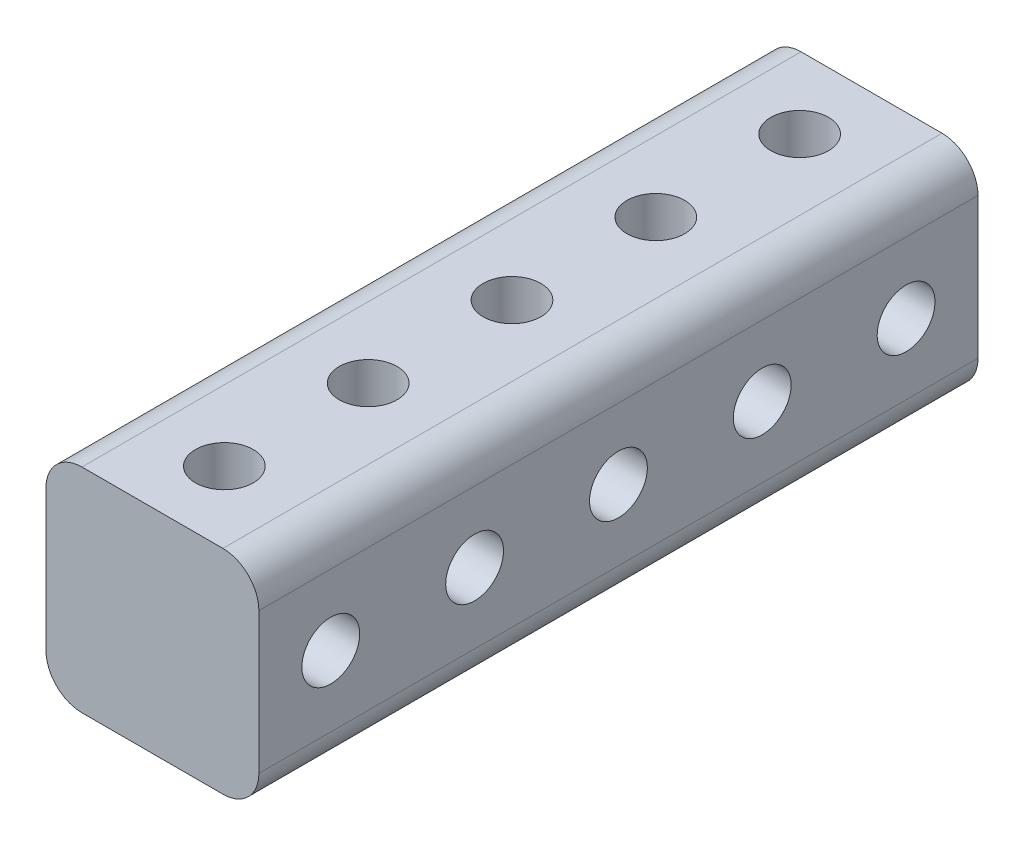
ISO-10303-21;
HEADER;
FILE_DESCRIPTION(('STEP AP214'),'2;1');
FILE_NAME('part.step','',(''),(''),'','','');
FILE_SCHEMA(('AUTOMOTIVE_DESIGN { 1 0 10303 214 1 1 1 1 }'));
ENDSEC;
DATA;
#1=APPLICATION_CONTEXT('core data for automotive mechanical design processes');
#2=APPLICATION_PROTOCOL_DEFINITION('international standard','automotive_design',2000,#1);
#3=PRODUCT_CONTEXT('',#1,'mechanical');
#4=PRODUCT('Part','Part','',(#3));
#5=PRODUCT_RELATED_PRODUCT_CATEGORY('part','',(#4));
#6=PRODUCT_DEFINITION_FORMATION('','',#4);
#7=PRODUCT_DEFINITION_CONTEXT('part definition',#1,'design');
#8=PRODUCT_DEFINITION('design','',#6,#7);
#9=PRODUCT_DEFINITION_SHAPE('','',#8);
#10=(LENGTH_UNIT() NAMED_UNIT(*) SI_UNIT(.MILLI.,.METRE.));
#11=(NAMED_UNIT(*) PLANE_ANGLE_UNIT() SI_UNIT($,.RADIAN.));
#12=(NAMED_UNIT(*) SI_UNIT($,.STERADIAN.) SOLID_ANGLE_UNIT());
#13=UNCERTAINTY_MEASURE_WITH_UNIT(LENGTH_MEASURE(1.E-05),#10,'distance_accuracy_value','');
#14=(GEOMETRIC_REPRESENTATION_CONTEXT(3) GLOBAL_UNCERTAINTY_ASSIGNED_CONTEXT((#13)) GLOBAL_UNIT_ASSIGNED_CONTEXT((#10,
#11,#12)) REPRESENTATION_CONTEXT('',''));
#15=CARTESIAN_POINT('',(0.,0.,0.));
#16=DIRECTION('',(0.,0.,1.));
#17=DIRECTION('',(1.,0.,0.));
#18=AXIS2_PLACEMENT_3D('',#15,#16,#17);
#19=CARTESIAN_POINT('',(9.398,-44.704,57.15));
#20=DIRECTION('',(0.,1.,0.));
#21=DIRECTION('',(0.,0.,1.));
#22=AXIS2_PLACEMENT_3D('',#19,#20,#21);
#23=CYLINDRICAL_SURFACE('',#22,2.5527);
#24=CARTESIAN_POINT('',(9.398,18.796,57.15));
#25=DIRECTION('',(0.,1.,0.));
#26=DIRECTION('',(0.,0.,1.));
#27=AXIS2_PLACEMENT_3D('',#24,#25,#26);
#28=CIRCLE('',#27,2.5527);
#29=CARTESIAN_POINT('',(9.398,18.796,59.7027));
#30=VERTEX_POINT('',#29);
#31=EDGE_CURVE('E402',#30,#30,#28,.T.);
#32=ORIENTED_EDGE('',*,*,#31,.T.);
#33=EDGE_LOOP('',(#32));
#34=FACE_BOUND('',#33,.T.);
#35=CARTESIAN_POINT('',(9.398,9.398,57.15));
#36=DIRECTION('',(-0.707106781186548,0.707106781186547,0.));
#37=DIRECTION('',(0.707106781186547,0.707106781186548,0.));
#38=AXIS2_PLACEMENT_3D('',#35,#36,#37);
#39=ELLIPSE('',#38,3.6100629606698,2.5527);
#40=CARTESIAN_POINT('',(9.398,9.398,54.5973));
#41=VERTEX_POINT('',#40);
#42=CARTESIAN_POINT('',(9.398,9.398,59.7027));
#43=VERTEX_POINT('',#42);
#44=EDGE_CURVE('E59',#41,#43,#39,.F.);
#45=ORIENTED_EDGE('',*,*,#44,.T.);
#46=CARTESIAN_POINT('',(9.398,9.398,57.15));
#47=DIRECTION('',(0.707106781186547,0.707106781186548,0.));
#48=DIRECTION('',(-0.707106781186548,0.707106781186547,0.));
#49=AXIS2_PLACEMENT_3D('',#46,#47,#48);
#50=ELLIPSE('',#49,3.6100629606698,2.5527);
#51=EDGE_CURVE('E11',#43,#41,#50,.F.);
#52=ORIENTED_EDGE('',*,*,#51,.T.);
#53=EDGE_LOOP('',(#45,#52));
#54=FACE_BOUND('',#53,.T.);
#55=ADVANCED_FACE('F45',(#34,#54),#23,.F.);
#56=CARTESIAN_POINT('',(9.398,-44.704,44.45));
#57=DIRECTION('',(0.,1.,0.));
#58=DIRECTION('',(0.,0.,1.));
#59=AXIS2_PLACEMENT_3D('',#56,#57,#58);
#60=CYLINDRICAL_SURFACE('',#59,2.5527);
#61=CARTESIAN_POINT('',(9.398,18.796,44.45));
#62=DIRECTION('',(0.,1.,0.));
#63=DIRECTION('',(0.,0.,1.));
#64=AXIS2_PLACEMENT_3D('',#61,#62,#63);
#65=CIRCLE('',#64,2.5527);
#66=CARTESIAN_POINT('',(9.398,18.796,47.0027));
#67=VERTEX_POINT('',#66);
#68=EDGE_CURVE('E405',#67,#67,#65,.T.);
#69=ORIENTED_EDGE('',*,*,#68,.T.);
#70=EDGE_LOOP('',(#69));
#71=FACE_BOUND('',#70,.T.);
#72=CARTESIAN_POINT('',(9.398,9.398,44.45));
#73=DIRECTION('',(-0.707106781186548,0.707106781186547,0.));
#74=DIRECTION('',(0.707106781186547,0.707106781186548,0.));
#75=AXIS2_PLACEMENT_3D('',#72,#73,#74);
#76=ELLIPSE('',#75,3.6100629606698,2.5527);
#77=CARTESIAN_POINT('',(9.398,9.398,41.8973));
#78=VERTEX_POINT('',#77);
#79=CARTESIAN_POINT('',(9.398,9.398,47.0027));
#80=VERTEX_POINT('',#79);
#81=EDGE_CURVE('E66',#78,#80,#76,.F.);
#82=ORIENTED_EDGE('',*,*,#81,.T.);
#83=CARTESIAN_POINT('',(9.398,9.398,44.45));
#84=DIRECTION('',(0.707106781186547,0.707106781186548,0.));
#85=DIRECTION('',(-0.707106781186548,0.707106781186547,0.));
#86=AXIS2_PLACEMENT_3D('',#83,#84,#85);
#87=ELLIPSE('',#86,3.6100629606698,2.5527);
#88=EDGE_CURVE('E209',#80,#78,#87,.F.);
#89=ORIENTED_EDGE('',*,*,#88,.T.);
#90=EDGE_LOOP('',(#82,#89));
#91=FACE_BOUND('',#90,.T.);
#92=ADVANCED_FACE('F229',(#71,#91),#60,.F.);
#93=CARTESIAN_POINT('',(9.398,-44.704,31.75));
#94=DIRECTION('',(0.,1.,0.));
#95=DIRECTION('',(0.,0.,1.));
#96=AXIS2_PLACEMENT_3D('',#93,#94,#95);
#97=CYLINDRICAL_SURFACE('',#96,2.5527);
#98=CARTESIAN_POINT('',(9.398,18.796,31.75));
#99=DIRECTION('',(0.,1.,0.));
#100=DIRECTION('',(0.,0.,1.));
#101=AXIS2_PLACEMENT_3D('',#98,#99,#100);
#102=CIRCLE('',#101,2.5527);
#103=CARTESIAN_POINT('',(9.398,18.796,34.3027));
#104=VERTEX_POINT('',#103);
#105=EDGE_CURVE('E410',#104,#104,#102,.T.);
#106=ORIENTED_EDGE('',*,*,#105,.T.);
#107=EDGE_LOOP('',(#106));
#108=FACE_BOUND('',#107,.T.);
#109=CARTESIAN_POINT('',(9.398,9.398,31.75));
#110=DIRECTION('',(-0.707106781186548,0.707106781186547,0.));
#111=DIRECTION('',(0.707106781186547,0.707106781186548,0.));
#112=AXIS2_PLACEMENT_3D('',#109,#110,#111);
#113=ELLIPSE('',#112,3.6100629606698,2.5527);
#114=CARTESIAN_POINT('',(9.398,9.398,29.1973));
#115=VERTEX_POINT('',#114);
#116=CARTESIAN_POINT('',(9.398,9.398,34.3027));
#117=VERTEX_POINT('',#116);
#118=EDGE_CURVE('E184',#115,#117,#113,.F.);
#119=ORIENTED_EDGE('',*,*,#118,.T.);
#120=CARTESIAN_POINT('',(9.398,9.398,31.75));
#121=DIRECTION('',(0.707106781186547,0.707106781186548,0.));
#122=DIRECTION('',(-0.707106781186548,0.707106781186547,0.));
#123=AXIS2_PLACEMENT_3D('',#120,#121,#122);
#124=ELLIPSE('',#123,3.6100629606698,2.5527);
#125=EDGE_CURVE('E195',#117,#115,#124,.F.);
#126=ORIENTED_EDGE('',*,*,#125,.T.);
#127=EDGE_LOOP('',(#119,#126));
#128=FACE_BOUND('',#127,.T.);
#129=ADVANCED_FACE('F236',(#108,#128),#97,.F.);
#130=CARTESIAN_POINT('',(9.398,-44.704,19.05));
#131=DIRECTION('',(0.,1.,0.));
#132=DIRECTION('',(0.,0.,1.));
#133=AXIS2_PLACEMENT_3D('',#130,#131,#132);
#134=CYLINDRICAL_SURFACE('',#133,2.5527);
#135=CARTESIAN_POINT('',(9.398,18.796,19.05));
#136=DIRECTION('',(0.,1.,0.));
#137=DIRECTION('',(0.,0.,1.));
#138=AXIS2_PLACEMENT_3D('',#135,#136,#137);
#139=CIRCLE('',#138,2.5527);
#140=CARTESIAN_POINT('',(9.398,18.796,21.6027));
#141=VERTEX_POINT('',#140);
#142=EDGE_CURVE('E414',#141,#141,#139,.T.);
#143=ORIENTED_EDGE('',*,*,#142,.T.);
#144=EDGE_LOOP('',(#143));
#145=FACE_BOUND('',#144,.T.);
#146=CARTESIAN_POINT('',(9.398,9.398,19.05));
#147=DIRECTION('',(-0.707106781186548,0.707106781186547,0.));
#148=DIRECTION('',(0.707106781186547,0.707106781186548,0.));
#149=AXIS2_PLACEMENT_3D('',#146,#147,#148);
#150=ELLIPSE('',#149,3.6100629606698,2.5527);
#151=CARTESIAN_POINT('',(9.398,9.398,16.4973));
#152=VERTEX_POINT('',#151);
#153=CARTESIAN_POINT('',(9.398,9.398,21.6027));
#154=VERTEX_POINT('',#153);
#155=EDGE_CURVE('E163',#152,#154,#150,.F.);
#156=ORIENTED_EDGE('',*,*,#155,.T.);
#157=CARTESIAN_POINT('',(9.398,9.398,19.05));
#158=DIRECTION('',(0.707106781186547,0.707106781186548,0.));
#159=DIRECTION('',(-0.707106781186548,0.707106781186547,0.));
#160=AXIS2_PLACEMENT_3D('',#157,#158,#159);
#161=ELLIPSE('',#160,3.6100629606698,2.5527);
#162=EDGE_CURVE('E180',#154,#152,#161,.F.);
#163=ORIENTED_EDGE('',*,*,#162,.T.);
#164=EDGE_LOOP('',(#156,#163));
#165=FACE_BOUND('',#164,.T.);
#166=ADVANCED_FACE('F488',(#145,#165),#134,.F.);
#167=CARTESIAN_POINT('',(9.398,-44.704,6.35));
#168=DIRECTION('',(0.,1.,0.));
#169=DIRECTION('',(0.,0.,1.));
#170=AXIS2_PLACEMENT_3D('',#167,#168,#169);
#171=CYLINDRICAL_SURFACE('',#170,2.5527);
#172=CARTESIAN_POINT('',(9.398,18.796,6.35));
#173=DIRECTION('',(0.,1.,0.));
#174=DIRECTION('',(0.,0.,1.));
#175=AXIS2_PLACEMENT_3D('',#172,#173,#174);
#176=CIRCLE('',#175,2.5527);
#177=CARTESIAN_POINT('',(9.398,18.796,8.9027));
#178=VERTEX_POINT('',#177);
#179=EDGE_CURVE('E401',#178,#178,#176,.T.);
#180=ORIENTED_EDGE('',*,*,#179,.T.);
#181=EDGE_LOOP('',(#180));
#182=FACE_BOUND('',#181,.T.);
#183=CARTESIAN_POINT('',(9.398,9.398,6.35000000000001));
#184=DIRECTION('',(-0.707106781186548,0.707106781186547,0.));
#185=DIRECTION('',(0.707106781186547,0.707106781186548,0.));
#186=AXIS2_PLACEMENT_3D('',#183,#184,#185);
#187=ELLIPSE('',#186,3.6100629606698,2.5527);
#188=CARTESIAN_POINT('',(9.398,9.398,3.79730000000001));
#189=VERTEX_POINT('',#188);
#190=CARTESIAN_POINT('',(9.398,9.398,8.90270000000001));
#191=VERTEX_POINT('',#190);
#192=EDGE_CURVE('E152',#189,#191,#187,.F.);
#193=ORIENTED_EDGE('',*,*,#192,.T.);
#194=CARTESIAN_POINT('',(9.398,9.398,6.35000000000001));
#195=DIRECTION('',(0.707106781186547,0.707106781186548,0.));
#196=DIRECTION('',(-0.707106781186548,0.707106781186547,0.));
#197=AXIS2_PLACEMENT_3D('',#194,#195,#196);
#198=ELLIPSE('',#197,3.6100629606698,2.5527);
#199=EDGE_CURVE('E147',#191,#189,#198,.F.);
#200=ORIENTED_EDGE('',*,*,#199,.T.);
#201=EDGE_LOOP('',(#193,#200));
#202=FACE_BOUND('',#201,.T.);
#203=ADVANCED_FACE('F161',(#182,#202),#171,.F.);
#204=CARTESIAN_POINT('',(0.,0.,63.5));
#205=DIRECTION('',(1.,0.,0.));
#206=DIRECTION('',(0.,1.,0.));
#207=AXIS2_PLACEMENT_3D('',#204,#205,#206);
#208=PLANE('',#207);
#209=CARTESIAN_POINT('',(0.,9.398,57.15));
#210=DIRECTION('',(1.,0.,0.));
#211=DIRECTION('',(0.,1.,0.));
#212=AXIS2_PLACEMENT_3D('',#209,#210,#211);
#213=CIRCLE('',#212,2.5527);
#214=CARTESIAN_POINT('',(0.,11.9507,57.15));
#215=VERTEX_POINT('',#214);
#216=EDGE_CURVE('E406',#215,#215,#213,.T.);
#217=ORIENTED_EDGE('',*,*,#216,.T.);
#218=EDGE_LOOP('',(#217));
#219=FACE_BOUND('',#218,.T.);
#220=CARTESIAN_POINT('',(0.,9.398,44.45));
#221=DIRECTION('',(1.,0.,0.));
#222=DIRECTION('',(0.,1.,0.));
#223=AXIS2_PLACEMENT_3D('',#220,#221,#222);
#224=CIRCLE('',#223,2.5527);
#225=CARTESIAN_POINT('',(0.,11.9507,44.45));
#226=VERTEX_POINT('',#225);
#227=EDGE_CURVE('E424',#226,#226,#224,.T.);
#228=ORIENTED_EDGE('',*,*,#227,.T.);
#229=EDGE_LOOP('',(#228));
#230=FACE_BOUND('',#229,.T.);
#231=CARTESIAN_POINT('',(0.,9.398,31.75));
#232=DIRECTION('',(1.,0.,0.));
#233=DIRECTION('',(0.,1.,0.));
#234=AXIS2_PLACEMENT_3D('',#231,#232,#233);
#235=CIRCLE('',#234,2.5527);
#236=CARTESIAN_POINT('',(0.,11.9507,31.75));
#237=VERTEX_POINT('',#236);
#238=EDGE_CURVE('E428',#237,#237,#235,.T.);
#239=ORIENTED_EDGE('',*,*,#238,.T.);
#240=EDGE_LOOP('',(#239));
#241=FACE_BOUND('',#240,.T.);
#242=CARTESIAN_POINT('',(0.,9.398,19.05));
#243=DIRECTION('',(1.,0.,0.));
#244=DIRECTION('',(0.,1.,0.));
#245=AXIS2_PLACEMENT_3D('',#242,#243,#244);
#246=CIRCLE('',#245,2.5527);
#247=CARTESIAN_POINT('',(0.,11.9507,19.05));
#248=VERTEX_POINT('',#247);
#249=EDGE_CURVE('E432',#248,#248,#246,.T.);
#250=ORIENTED_EDGE('',*,*,#249,.T.);
#251=EDGE_LOOP('',(#250));
#252=FACE_BOUND('',#251,.T.);
#253=CARTESIAN_POINT('',(0.,9.398,6.35000000000002));
#254=DIRECTION('',(1.,0.,0.));
#255=DIRECTION('',(0.,1.,0.));
#256=AXIS2_PLACEMENT_3D('',#253,#254,#255);
#257=CIRCLE('',#256,2.5527);
#258=CARTESIAN_POINT('',(0.,11.9507,6.35000000000002));
#259=VERTEX_POINT('',#258);
#260=EDGE_CURVE('E436',#259,#259,#257,.T.);
#261=ORIENTED_EDGE('',*,*,#260,.T.);
#262=EDGE_LOOP('',(#261));
#263=FACE_BOUND('',#262,.T.);
#264=DIRECTION('',(0.,-1.,0.));
#265=VECTOR('',#264,1.);
#266=CARTESIAN_POINT('',(0.,0.,63.5));
#267=LINE('',#266,#265);
#268=CARTESIAN_POINT('',(0.,15.621,63.5));
#269=VERTEX_POINT('',#268);
#270=CARTESIAN_POINT('',(0.,3.175,63.5));
#271=VERTEX_POINT('',#270);
#272=EDGE_CURVE('E314',#269,#271,#267,.T.);
#273=ORIENTED_EDGE('',*,*,#272,.F.);
#274=DIRECTION('',(0.,0.,-1.));
#275=VECTOR('',#274,1.);
#276=CARTESIAN_POINT('',(0.,15.621,63.5));
#277=LINE('',#276,#275);
#278=CARTESIAN_POINT('',(0.,15.621,0.));
#279=VERTEX_POINT('',#278);
#280=EDGE_CURVE('E342',#269,#279,#277,.T.);
#281=ORIENTED_EDGE('',*,*,#280,.T.);
#282=DIRECTION('',(0.,-1.,0.));
#283=VECTOR('',#282,1.);
#284=CARTESIAN_POINT('',(0.,0.,0.));
#285=LINE('',#284,#283);
#286=CARTESIAN_POINT('',(0.,3.175,0.));
#287=VERTEX_POINT('',#286);
#288=EDGE_CURVE('E335',#279,#287,#285,.T.);
#289=ORIENTED_EDGE('',*,*,#288,.T.);
#290=DIRECTION('',(0.,0.,-1.));
#291=VECTOR('',#290,1.);
#292=CARTESIAN_POINT('',(0.,3.175,63.5));
#293=LINE('',#292,#291);
#294=EDGE_CURVE('E339',#287,#271,#293,.F.);
#295=ORIENTED_EDGE('',*,*,#294,.T.);
#296=EDGE_LOOP('',(#273,#281,#289,#295));
#297=FACE_BOUND('',#296,.T.);
#298=ADVANCED_FACE('F367',(#219,#230,#241,#252,#263,#297),#208,.F.);
#299=CARTESIAN_POINT('',(0.,0.,63.5));
#300=DIRECTION('',(0.,1.,0.));
#301=DIRECTION('',(0.,0.,1.));
#302=AXIS2_PLACEMENT_3D('',#299,#300,#301);
#303=PLANE('',#302);
#304=CARTESIAN_POINT('',(9.398,0.,6.35));
#305=DIRECTION('',(0.,1.,0.));
#306=DIRECTION('',(0.,0.,1.));
#307=AXIS2_PLACEMENT_3D('',#304,#305,#306);
#308=CIRCLE('',#307,2.5527);
#309=CARTESIAN_POINT('',(9.398,0.,8.9027));
#310=VERTEX_POINT('',#309);
#311=EDGE_CURVE('E372',#310,#310,#308,.T.);
#312=ORIENTED_EDGE('',*,*,#311,.T.);
#313=EDGE_LOOP('',(#312));
#314=FACE_BOUND('',#313,.T.);
#315=CARTESIAN_POINT('',(9.398,0.,19.05));
#316=DIRECTION('',(0.,1.,0.));
#317=DIRECTION('',(0.,0.,1.));
#318=AXIS2_PLACEMENT_3D('',#315,#316,#317);
#319=CIRCLE('',#318,2.5527);
#320=CARTESIAN_POINT('',(9.398,0.,21.6027));
#321=VERTEX_POINT('',#320);
#322=EDGE_CURVE('E381',#321,#321,#319,.T.);
#323=ORIENTED_EDGE('',*,*,#322,.T.);
#324=EDGE_LOOP('',(#323));
#325=FACE_BOUND('',#324,.T.);
#326=CARTESIAN_POINT('',(9.398,0.,31.75));
#327=DIRECTION('',(0.,1.,0.));
#328=DIRECTION('',(0.,0.,1.));
#329=AXIS2_PLACEMENT_3D('',#326,#327,#328);
#330=CIRCLE('',#329,2.5527);
#331=CARTESIAN_POINT('',(9.398,0.,34.3027));
#332=VERTEX_POINT('',#331);
#333=EDGE_CURVE('E386',#332,#332,#330,.T.);
#334=ORIENTED_EDGE('',*,*,#333,.T.);
#335=EDGE_LOOP('',(#334));
#336=FACE_BOUND('',#335,.T.);
#337=CARTESIAN_POINT('',(9.398,0.,44.45));
#338=DIRECTION('',(0.,1.,0.));
#339=DIRECTION('',(0.,0.,1.));
#340=AXIS2_PLACEMENT_3D('',#337,#338,#339);
#341=CIRCLE('',#340,2.5527);
#342=CARTESIAN_POINT('',(9.398,0.,47.0027));
#343=VERTEX_POINT('',#342);
#344=EDGE_CURVE('E391',#343,#343,#341,.T.);
#345=ORIENTED_EDGE('',*,*,#344,.T.);
#346=EDGE_LOOP('',(#345));
#347=FACE_BOUND('',#346,.T.);
#348=CARTESIAN_POINT('',(9.398,0.,57.15));
#349=DIRECTION('',(0.,1.,0.));
#350=DIRECTION('',(0.,0.,1.));
#351=AXIS2_PLACEMENT_3D('',#348,#349,#350);
#352=CIRCLE('',#351,2.5527);
#353=CARTESIAN_POINT('',(9.398,0.,59.7027));
#354=VERTEX_POINT('',#353);
#355=EDGE_CURVE('E397',#354,#354,#352,.T.);
#356=ORIENTED_EDGE('',*,*,#355,.T.);
#357=EDGE_LOOP('',(#356));
#358=FACE_BOUND('',#357,.T.);
#359=DIRECTION('',(1.,0.,0.));
#360=VECTOR('',#359,1.);
#361=CARTESIAN_POINT('',(0.,0.,0.));
#362=LINE('',#361,#360);
#363=CARTESIAN_POINT('',(3.175,0.,0.));
#364=VERTEX_POINT('',#363);
#365=CARTESIAN_POINT('',(15.621,0.,0.));
#366=VERTEX_POINT('',#365);
#367=EDGE_CURVE('E305',#364,#366,#362,.T.);
#368=ORIENTED_EDGE('',*,*,#367,.T.);
#369=DIRECTION('',(0.,0.,-1.));
#370=VECTOR('',#369,1.);
#371=CARTESIAN_POINT('',(15.621,0.,63.5));
#372=LINE('',#371,#370);
#373=CARTESIAN_POINT('',(15.621,0.,63.5));
#374=VERTEX_POINT('',#373);
#375=EDGE_CURVE('E159',#366,#374,#372,.F.);
#376=ORIENTED_EDGE('',*,*,#375,.T.);
#377=DIRECTION('',(1.,0.,0.));
#378=VECTOR('',#377,1.);
#379=CARTESIAN_POINT('',(0.,0.,63.5));
#380=LINE('',#379,#378);
#381=CARTESIAN_POINT('',(3.175,0.,63.5));
#382=VERTEX_POINT('',#381);
#383=EDGE_CURVE('E302',#382,#374,#380,.T.);
#384=ORIENTED_EDGE('',*,*,#383,.F.);
#385=DIRECTION('',(0.,0.,-1.));
#386=VECTOR('',#385,1.);
#387=CARTESIAN_POINT('',(3.175,0.,63.5));
#388=LINE('',#387,#386);
#389=EDGE_CURVE('E291',#382,#364,#388,.T.);
#390=ORIENTED_EDGE('',*,*,#389,.T.);
#391=EDGE_LOOP('',(#368,#376,#384,#390));
#392=FACE_BOUND('',#391,.T.);
#393=ADVANCED_FACE('F301',(#314,#325,#336,#347,#358,#392),#303,.F.);
#394=CARTESIAN_POINT('',(18.796,0.,63.5));
#395=DIRECTION('',(-1.,0.,0.));
#396=DIRECTION('',(0.,-1.,0.));
#397=AXIS2_PLACEMENT_3D('',#394,#395,#396);
#398=PLANE('',#397);
#399=CARTESIAN_POINT('',(18.796,9.398,57.15));
#400=DIRECTION('',(1.,0.,0.));
#401=DIRECTION('',(0.,1.,0.));
#402=AXIS2_PLACEMENT_3D('',#399,#400,#401);
#403=CIRCLE('',#402,2.5527);
#404=CARTESIAN_POINT('',(18.796,11.9507,57.15));
#405=VERTEX_POINT('',#404);
#406=EDGE_CURVE('E440',#405,#405,#403,.T.);
#407=ORIENTED_EDGE('',*,*,#406,.F.);
#408=EDGE_LOOP('',(#407));
#409=FACE_BOUND('',#408,.T.);
#410=CARTESIAN_POINT('',(18.796,9.398,44.45));
#411=DIRECTION('',(1.,0.,0.));
#412=DIRECTION('',(0.,1.,0.));
#413=AXIS2_PLACEMENT_3D('',#410,#411,#412);
#414=CIRCLE('',#413,2.5527);
#415=CARTESIAN_POINT('',(18.796,11.9507,44.45));
#416=VERTEX_POINT('',#415);
#417=EDGE_CURVE('E453',#416,#416,#414,.T.);
#418=ORIENTED_EDGE('',*,*,#417,.F.);
#419=EDGE_LOOP('',(#418));
#420=FACE_BOUND('',#419,.T.);
#421=CARTESIAN_POINT('',(18.796,9.398,31.75));
#422=DIRECTION('',(1.,0.,0.));
#423=DIRECTION('',(0.,1.,0.));
#424=AXIS2_PLACEMENT_3D('',#421,#422,#423);
#425=CIRCLE('',#424,2.5527);
#426=CARTESIAN_POINT('',(18.796,11.9507,31.75));
#427=VERTEX_POINT('',#426);
#428=EDGE_CURVE('E449',#427,#427,#425,.T.);
#429=ORIENTED_EDGE('',*,*,#428,.F.);
#430=EDGE_LOOP('',(#429));
#431=FACE_BOUND('',#430,.T.);
#432=CARTESIAN_POINT('',(18.796,9.398,19.05));
#433=DIRECTION('',(1.,0.,0.));
#434=DIRECTION('',(0.,1.,0.));
#435=AXIS2_PLACEMENT_3D('',#432,#433,#434);
#436=CIRCLE('',#435,2.5527);
#437=CARTESIAN_POINT('',(18.796,11.9507,19.05));
#438=VERTEX_POINT('',#437);
#439=EDGE_CURVE('E445',#438,#438,#436,.T.);
#440=ORIENTED_EDGE('',*,*,#439,.F.);
#441=EDGE_LOOP('',(#440));
#442=FACE_BOUND('',#441,.T.);
#443=CARTESIAN_POINT('',(18.796,9.398,6.35000000000002));
#444=DIRECTION('',(1.,0.,0.));
#445=DIRECTION('',(0.,1.,0.));
#446=AXIS2_PLACEMENT_3D('',#443,#444,#445);
#447=CIRCLE('',#446,2.5527);
#448=CARTESIAN_POINT('',(18.796,11.9507,6.35000000000002));
#449=VERTEX_POINT('',#448);
#450=EDGE_CURVE('E441',#449,#449,#447,.T.);
#451=ORIENTED_EDGE('',*,*,#450,.F.);
#452=EDGE_LOOP('',(#451));
#453=FACE_BOUND('',#452,.T.);
#454=DIRECTION('',(0.,1.,0.));
#455=VECTOR('',#454,1.);
#456=CARTESIAN_POINT('',(18.796,0.,63.5));
#457=LINE('',#456,#455);
#458=CARTESIAN_POINT('',(18.796,3.175,63.5));
#459=VERTEX_POINT('',#458);
#460=CARTESIAN_POINT('',(18.796,15.621,63.5));
#461=VERTEX_POINT('',#460);
#462=EDGE_CURVE('E313',#459,#461,#457,.T.);
#463=ORIENTED_EDGE('',*,*,#462,.F.);
#464=DIRECTION('',(0.,0.,-1.));
#465=VECTOR('',#464,1.);
#466=CARTESIAN_POINT('',(18.796,3.175,63.5));
#467=LINE('',#466,#465);
#468=CARTESIAN_POINT('',(18.796,3.175,0.));
#469=VERTEX_POINT('',#468);
#470=EDGE_CURVE('E287',#459,#469,#467,.T.);
#471=ORIENTED_EDGE('',*,*,#470,.T.);
#472=DIRECTION('',(0.,1.,0.));
#473=VECTOR('',#472,1.);
#474=CARTESIAN_POINT('',(18.796,0.,0.));
#475=LINE('',#474,#473);
#476=CARTESIAN_POINT('',(18.796,15.621,0.));
#477=VERTEX_POINT('',#476);
#478=EDGE_CURVE('E322',#469,#477,#475,.T.);
#479=ORIENTED_EDGE('',*,*,#478,.T.);
#480=DIRECTION('',(0.,0.,-1.));
#481=VECTOR('',#480,1.);
#482=CARTESIAN_POINT('',(18.796,15.621,63.5));
#483=LINE('',#482,#481);
#484=EDGE_CURVE('E262',#477,#461,#483,.F.);
#485=ORIENTED_EDGE('',*,*,#484,.T.);
#486=EDGE_LOOP('',(#463,#471,#479,#485));
#487=FACE_BOUND('',#486,.T.);
#488=ADVANCED_FACE('F321',(#409,#420,#431,#442,#453,#487),#398,.F.);
#489=CARTESIAN_POINT('',(0.,18.796,63.5));
#490=DIRECTION('',(0.,-1.,0.));
#491=DIRECTION('',(0.,0.,-1.));
#492=AXIS2_PLACEMENT_3D('',#489,#490,#491);
#493=PLANE('',#492);
#494=ORIENTED_EDGE('',*,*,#179,.F.);
#495=EDGE_LOOP('',(#494));
#496=FACE_BOUND('',#495,.T.);
#497=ORIENTED_EDGE('',*,*,#142,.F.);
#498=EDGE_LOOP('',(#497));
#499=FACE_BOUND('',#498,.T.);
#500=ORIENTED_EDGE('',*,*,#105,.F.);
#501=EDGE_LOOP('',(#500));
#502=FACE_BOUND('',#501,.T.);
#503=ORIENTED_EDGE('',*,*,#68,.F.);
#504=EDGE_LOOP('',(#503));
#505=FACE_BOUND('',#504,.T.);
#506=ORIENTED_EDGE('',*,*,#31,.F.);
#507=EDGE_LOOP('',(#506));
#508=FACE_BOUND('',#507,.T.);
#509=DIRECTION('',(-1.,0.,0.));
#510=VECTOR('',#509,1.);
#511=CARTESIAN_POINT('',(0.,18.796,0.));
#512=LINE('',#511,#510);
#513=CARTESIAN_POINT('',(15.621,18.796,0.));
#514=VERTEX_POINT('',#513);
#515=CARTESIAN_POINT('',(3.175,18.796,0.));
#516=VERTEX_POINT('',#515);
#517=EDGE_CURVE('E329',#514,#516,#512,.T.);
#518=ORIENTED_EDGE('',*,*,#517,.T.);
#519=DIRECTION('',(0.,0.,-1.));
#520=VECTOR('',#519,1.);
#521=CARTESIAN_POINT('',(3.175,18.796,63.5));
#522=LINE('',#521,#520);
#523=CARTESIAN_POINT('',(3.175,18.796,63.5));
#524=VERTEX_POINT('',#523);
#525=EDGE_CURVE('E271',#516,#524,#522,.F.);
#526=ORIENTED_EDGE('',*,*,#525,.T.);
#527=DIRECTION('',(-1.,0.,0.));
#528=VECTOR('',#527,1.);
#529=CARTESIAN_POINT('',(0.,18.796,63.5));
#530=LINE('',#529,#528);
#531=CARTESIAN_POINT('',(15.621,18.796,63.5));
#532=VERTEX_POINT('',#531);
#533=EDGE_CURVE('E343',#532,#524,#530,.T.);
#534=ORIENTED_EDGE('',*,*,#533,.F.);
#535=DIRECTION('',(0.,0.,-1.));
#536=VECTOR('',#535,1.);
#537=CARTESIAN_POINT('',(15.621,18.796,63.5));
#538=LINE('',#537,#536);
#539=EDGE_CURVE('E264',#532,#514,#538,.T.);
#540=ORIENTED_EDGE('',*,*,#539,.T.);
#541=EDGE_LOOP('',(#518,#526,#534,#540));
#542=FACE_BOUND('',#541,.T.);
#543=ADVANCED_FACE('F358',(#496,#499,#502,#505,#508,#542),#493,.F.);
#544=CARTESIAN_POINT('',(0.,0.,63.5));
#545=DIRECTION('',(0.,0.,-1.));
#546=DIRECTION('',(-1.,0.,0.));
#547=AXIS2_PLACEMENT_3D('',#544,#545,#546);
#548=PLANE('',#547);
#549=ORIENTED_EDGE('',*,*,#533,.T.);
#550=CARTESIAN_POINT('',(3.175,15.621,63.5));
#551=DIRECTION('',(0.,0.,-1.));
#552=DIRECTION('',(-1.,0.,0.));
#553=AXIS2_PLACEMENT_3D('',#550,#551,#552);
#554=CIRCLE('',#553,3.175);
#555=EDGE_CURVE('E282',#524,#269,#554,.F.);
#556=ORIENTED_EDGE('',*,*,#555,.T.);
#557=ORIENTED_EDGE('',*,*,#272,.T.);
#558=CARTESIAN_POINT('',(3.175,3.175,63.5));
#559=DIRECTION('',(0.,0.,-1.));
#560=DIRECTION('',(-1.,0.,0.));
#561=AXIS2_PLACEMENT_3D('',#558,#559,#560);
#562=CIRCLE('',#561,3.175);
#563=EDGE_CURVE('E270',#271,#382,#562,.F.);
#564=ORIENTED_EDGE('',*,*,#563,.T.);
#565=ORIENTED_EDGE('',*,*,#383,.T.);
#566=CARTESIAN_POINT('',(15.621,3.175,63.5));
#567=DIRECTION('',(0.,0.,-1.));
#568=DIRECTION('',(-1.,0.,0.));
#569=AXIS2_PLACEMENT_3D('',#566,#567,#568);
#570=CIRCLE('',#569,3.175);
#571=EDGE_CURVE('E275',#374,#459,#570,.F.);
#572=ORIENTED_EDGE('',*,*,#571,.T.);
#573=ORIENTED_EDGE('',*,*,#462,.T.);
#574=CARTESIAN_POINT('',(15.621,15.621,63.5));
#575=DIRECTION('',(0.,0.,-1.));
#576=DIRECTION('',(-1.,0.,0.));
#577=AXIS2_PLACEMENT_3D('',#574,#575,#576);
#578=CIRCLE('',#577,3.175);
#579=EDGE_CURVE('E261',#461,#532,#578,.F.);
#580=ORIENTED_EDGE('',*,*,#579,.T.);
#581=EDGE_LOOP('',(#549,#556,#557,#564,#565,#572,#573,#580));
#582=FACE_BOUND('',#581,.T.);
#583=ADVANCED_FACE('F308',(#582),#548,.F.);
#584=CARTESIAN_POINT('',(0.,0.,0.));
#585=DIRECTION('',(0.,0.,-1.));
#586=DIRECTION('',(-1.,0.,0.));
#587=AXIS2_PLACEMENT_3D('',#584,#585,#586);
#588=PLANE('',#587);
#589=ORIENTED_EDGE('',*,*,#288,.F.);
#590=CARTESIAN_POINT('',(3.175,15.621,0.));
#591=DIRECTION('',(0.,0.,-1.));
#592=DIRECTION('',(-1.,0.,0.));
#593=AXIS2_PLACEMENT_3D('',#590,#591,#592);
#594=CIRCLE('',#593,3.175);
#595=EDGE_CURVE('E354',#279,#516,#594,.T.);
#596=ORIENTED_EDGE('',*,*,#595,.T.);
#597=ORIENTED_EDGE('',*,*,#517,.F.);
#598=CARTESIAN_POINT('',(15.621,15.621,0.));
#599=DIRECTION('',(0.,0.,-1.));
#600=DIRECTION('',(-1.,0.,0.));
#601=AXIS2_PLACEMENT_3D('',#598,#599,#600);
#602=CIRCLE('',#601,3.175);
#603=EDGE_CURVE('E327',#514,#477,#602,.T.);
#604=ORIENTED_EDGE('',*,*,#603,.T.);
#605=ORIENTED_EDGE('',*,*,#478,.F.);
#606=CARTESIAN_POINT('',(15.621,3.175,0.));
#607=DIRECTION('',(0.,0.,-1.));
#608=DIRECTION('',(-1.,0.,0.));
#609=AXIS2_PLACEMENT_3D('',#606,#607,#608);
#610=CIRCLE('',#609,3.175);
#611=EDGE_CURVE('E317',#469,#366,#610,.T.);
#612=ORIENTED_EDGE('',*,*,#611,.T.);
#613=ORIENTED_EDGE('',*,*,#367,.F.);
#614=CARTESIAN_POINT('',(3.175,3.175,0.));
#615=DIRECTION('',(0.,0.,-1.));
#616=DIRECTION('',(-1.,0.,0.));
#617=AXIS2_PLACEMENT_3D('',#614,#615,#616);
#618=CIRCLE('',#617,3.175);
#619=EDGE_CURVE('E349',#364,#287,#618,.T.);
#620=ORIENTED_EDGE('',*,*,#619,.T.);
#621=EDGE_LOOP('',(#589,#596,#597,#604,#605,#612,#613,#620));
#622=FACE_BOUND('',#621,.T.);
#623=ADVANCED_FACE('F325',(#622),#588,.T.);
#624=CARTESIAN_POINT('',(3.175,15.621,63.5));
#625=DIRECTION('',(0.,0.,-1.));
#626=DIRECTION('',(-1.,0.,0.));
#627=AXIS2_PLACEMENT_3D('',#624,#625,#626);
#628=CYLINDRICAL_SURFACE('',#627,3.175);
#629=ORIENTED_EDGE('',*,*,#555,.F.);
#630=ORIENTED_EDGE('',*,*,#525,.F.);
#631=ORIENTED_EDGE('',*,*,#595,.F.);
#632=ORIENTED_EDGE('',*,*,#280,.F.);
#633=EDGE_LOOP('',(#629,#630,#631,#632));
#634=FACE_BOUND('',#633,.T.);
#635=ADVANCED_FACE('F364',(#634),#628,.T.);
#636=CARTESIAN_POINT('',(15.621,3.175,63.5));
#637=DIRECTION('',(0.,0.,-1.));
#638=DIRECTION('',(-1.,0.,0.));
#639=AXIS2_PLACEMENT_3D('',#636,#637,#638);
#640=CYLINDRICAL_SURFACE('',#639,3.175);
#641=ORIENTED_EDGE('',*,*,#571,.F.);
#642=ORIENTED_EDGE('',*,*,#375,.F.);
#643=ORIENTED_EDGE('',*,*,#611,.F.);
#644=ORIENTED_EDGE('',*,*,#470,.F.);
#645=EDGE_LOOP('',(#641,#642,#643,#644));
#646=FACE_BOUND('',#645,.T.);
#647=ADVANCED_FACE('F256',(#646),#640,.T.);
#648=CARTESIAN_POINT('',(3.175,3.175,63.5));
#649=DIRECTION('',(0.,0.,-1.));
#650=DIRECTION('',(-1.,0.,0.));
#651=AXIS2_PLACEMENT_3D('',#648,#649,#650);
#652=CYLINDRICAL_SURFACE('',#651,3.175);
#653=ORIENTED_EDGE('',*,*,#563,.F.);
#654=ORIENTED_EDGE('',*,*,#294,.F.);
#655=ORIENTED_EDGE('',*,*,#619,.F.);
#656=ORIENTED_EDGE('',*,*,#389,.F.);
#657=EDGE_LOOP('',(#653,#654,#655,#656));
#658=FACE_BOUND('',#657,.T.);
#659=ADVANCED_FACE('F250',(#658),#652,.T.);
#660=CARTESIAN_POINT('',(15.621,15.621,63.5));
#661=DIRECTION('',(0.,0.,-1.));
#662=DIRECTION('',(-1.,0.,0.));
#663=AXIS2_PLACEMENT_3D('',#660,#661,#662);
#664=CYLINDRICAL_SURFACE('',#663,3.175);
#665=ORIENTED_EDGE('',*,*,#579,.F.);
#666=ORIENTED_EDGE('',*,*,#484,.F.);
#667=ORIENTED_EDGE('',*,*,#603,.F.);
#668=ORIENTED_EDGE('',*,*,#539,.F.);
#669=EDGE_LOOP('',(#665,#666,#667,#668));
#670=FACE_BOUND('',#669,.T.);
#671=ADVANCED_FACE('F47',(#670),#664,.T.);
#672=CARTESIAN_POINT('',(9.398,9.398,57.15));
#673=DIRECTION('',(-0.707106781186548,0.707106781186547,0.));
#674=DIRECTION('',(0.707106781186547,0.707106781186548,0.));
#675=AXIS2_PLACEMENT_3D('',#672,#673,#674);
#676=ELLIPSE('',#675,3.6100629606698,2.5527);
#677=EDGE_CURVE('E214',#41,#43,#676,.T.);
#678=ORIENTED_EDGE('',*,*,#677,.T.);
#679=CARTESIAN_POINT('',(9.398,9.398,57.15));
#680=DIRECTION('',(0.707106781186547,0.707106781186548,0.));
#681=DIRECTION('',(-0.707106781186548,0.707106781186547,0.));
#682=AXIS2_PLACEMENT_3D('',#679,#680,#681);
#683=ELLIPSE('',#682,3.6100629606698,2.5527);
#684=EDGE_CURVE('E54',#43,#41,#683,.T.);
#685=ORIENTED_EDGE('',*,*,#684,.T.);
#686=EDGE_LOOP('',(#678,#685));
#687=FACE_BOUND('',#686,.T.);
#688=ORIENTED_EDGE('',*,*,#355,.F.);
#689=EDGE_LOOP('',(#688));
#690=FACE_BOUND('',#689,.T.);
#691=ADVANCED_FACE('F220',(#687,#690),#23,.F.);
#692=CARTESIAN_POINT('',(9.398,9.398,44.45));
#693=DIRECTION('',(-0.707106781186548,0.707106781186547,0.));
#694=DIRECTION('',(0.707106781186547,0.707106781186548,0.));
#695=AXIS2_PLACEMENT_3D('',#692,#693,#694);
#696=ELLIPSE('',#695,3.6100629606698,2.5527);
#697=EDGE_CURVE('E201',#78,#80,#696,.T.);
#698=ORIENTED_EDGE('',*,*,#697,.T.);
#699=CARTESIAN_POINT('',(9.398,9.398,44.45));
#700=DIRECTION('',(0.707106781186547,0.707106781186548,0.));
#701=DIRECTION('',(-0.707106781186548,0.707106781186547,0.));
#702=AXIS2_PLACEMENT_3D('',#699,#700,#701);
#703=ELLIPSE('',#702,3.6100629606698,2.5527);
#704=EDGE_CURVE('E205',#80,#78,#703,.T.);
#705=ORIENTED_EDGE('',*,*,#704,.T.);
#706=EDGE_LOOP('',(#698,#705));
#707=FACE_BOUND('',#706,.T.);
#708=ORIENTED_EDGE('',*,*,#344,.F.);
#709=EDGE_LOOP('',(#708));
#710=FACE_BOUND('',#709,.T.);
#711=ADVANCED_FACE('F239',(#707,#710),#60,.F.);
#712=CARTESIAN_POINT('',(9.398,9.398,31.75));
#713=DIRECTION('',(-0.707106781186548,0.707106781186547,0.));
#714=DIRECTION('',(0.707106781186547,0.707106781186548,0.));
#715=AXIS2_PLACEMENT_3D('',#712,#713,#714);
#716=ELLIPSE('',#715,3.6100629606698,2.5527);
#717=EDGE_CURVE('E187',#115,#117,#716,.T.);
#718=ORIENTED_EDGE('',*,*,#717,.T.);
#719=CARTESIAN_POINT('',(9.398,9.398,31.75));
#720=DIRECTION('',(0.707106781186547,0.707106781186548,0.));
#721=DIRECTION('',(-0.707106781186548,0.707106781186547,0.));
#722=AXIS2_PLACEMENT_3D('',#719,#720,#721);
#723=ELLIPSE('',#722,3.6100629606698,2.5527);
#724=EDGE_CURVE('E191',#117,#115,#723,.T.);
#725=ORIENTED_EDGE('',*,*,#724,.T.);
#726=EDGE_LOOP('',(#718,#725));
#727=FACE_BOUND('',#726,.T.);
#728=ORIENTED_EDGE('',*,*,#333,.F.);
#729=EDGE_LOOP('',(#728));
#730=FACE_BOUND('',#729,.T.);
#731=ADVANCED_FACE('F247',(#727,#730),#97,.F.);
#732=CARTESIAN_POINT('',(9.398,9.398,19.05));
#733=DIRECTION('',(-0.707106781186548,0.707106781186547,0.));
#734=DIRECTION('',(0.707106781186547,0.707106781186548,0.));
#735=AXIS2_PLACEMENT_3D('',#732,#733,#734);
#736=ELLIPSE('',#735,3.6100629606698,2.5527);
#737=EDGE_CURVE('E172',#152,#154,#736,.T.);
#738=ORIENTED_EDGE('',*,*,#737,.T.);
#739=CARTESIAN_POINT('',(9.398,9.398,19.05));
#740=DIRECTION('',(0.707106781186547,0.707106781186548,0.));
#741=DIRECTION('',(-0.707106781186548,0.707106781186547,0.));
#742=AXIS2_PLACEMENT_3D('',#739,#740,#741);
#743=ELLIPSE('',#742,3.6100629606698,2.5527);
#744=EDGE_CURVE('E176',#154,#152,#743,.T.);
#745=ORIENTED_EDGE('',*,*,#744,.T.);
#746=EDGE_LOOP('',(#738,#745));
#747=FACE_BOUND('',#746,.T.);
#748=ORIENTED_EDGE('',*,*,#322,.F.);
#749=EDGE_LOOP('',(#748));
#750=FACE_BOUND('',#749,.T.);
#751=ADVANCED_FACE('F479',(#747,#750),#134,.F.);
#752=CARTESIAN_POINT('',(9.398,9.398,6.35000000000001));
#753=DIRECTION('',(-0.707106781186548,0.707106781186547,0.));
#754=DIRECTION('',(0.707106781186547,0.707106781186548,0.));
#755=AXIS2_PLACEMENT_3D('',#752,#753,#754);
#756=ELLIPSE('',#755,3.6100629606698,2.5527);
#757=EDGE_CURVE('E142',#189,#191,#756,.T.);
#758=ORIENTED_EDGE('',*,*,#757,.T.);
#759=CARTESIAN_POINT('',(9.398,9.398,6.35000000000001));
#760=DIRECTION('',(0.707106781186547,0.707106781186548,0.));
#761=DIRECTION('',(-0.707106781186548,0.707106781186547,0.));
#762=AXIS2_PLACEMENT_3D('',#759,#760,#761);
#763=ELLIPSE('',#762,3.6100629606698,2.5527);
#764=EDGE_CURVE('E151',#191,#189,#763,.T.);
#765=ORIENTED_EDGE('',*,*,#764,.T.);
#766=EDGE_LOOP('',(#758,#765));
#767=FACE_BOUND('',#766,.T.);
#768=ORIENTED_EDGE('',*,*,#311,.F.);
#769=EDGE_LOOP('',(#768));
#770=FACE_BOUND('',#769,.T.);
#771=ADVANCED_FACE('F165',(#767,#770),#171,.F.);
#772=CARTESIAN_POINT('',(-44.704,9.39799999999999,6.35000000000002));
#773=DIRECTION('',(1.,0.,0.));
#774=DIRECTION('',(0.,1.,0.));
#775=AXIS2_PLACEMENT_3D('',#772,#773,#774);
#776=CYLINDRICAL_SURFACE('',#775,2.5527);
#777=ORIENTED_EDGE('',*,*,#450,.T.);
#778=EDGE_LOOP('',(#777));
#779=FACE_BOUND('',#778,.T.);
#780=ORIENTED_EDGE('',*,*,#192,.F.);
#781=ORIENTED_EDGE('',*,*,#764,.F.);
#782=EDGE_LOOP('',(#780,#781));
#783=FACE_BOUND('',#782,.T.);
#784=ADVANCED_FACE('F156',(#779,#783),#776,.F.);
#785=ORIENTED_EDGE('',*,*,#757,.F.);
#786=ORIENTED_EDGE('',*,*,#199,.F.);
#787=EDGE_LOOP('',(#785,#786));
#788=FACE_BOUND('',#787,.T.);
#789=ORIENTED_EDGE('',*,*,#260,.F.);
#790=EDGE_LOOP('',(#789));
#791=FACE_BOUND('',#790,.T.);
#792=ADVANCED_FACE('F144',(#788,#791),#776,.F.);
#793=CARTESIAN_POINT('',(-44.704,9.39799999999999,19.05));
#794=DIRECTION('',(1.,0.,0.));
#795=DIRECTION('',(0.,1.,0.));
#796=AXIS2_PLACEMENT_3D('',#793,#794,#795);
#797=CYLINDRICAL_SURFACE('',#796,2.5527);
#798=ORIENTED_EDGE('',*,*,#439,.T.);
#799=EDGE_LOOP('',(#798));
#800=FACE_BOUND('',#799,.T.);
#801=ORIENTED_EDGE('',*,*,#155,.F.);
#802=ORIENTED_EDGE('',*,*,#744,.F.);
#803=EDGE_LOOP('',(#801,#802));
#804=FACE_BOUND('',#803,.T.);
#805=ADVANCED_FACE('F478',(#800,#804),#797,.F.);
#806=ORIENTED_EDGE('',*,*,#737,.F.);
#807=ORIENTED_EDGE('',*,*,#162,.F.);
#808=EDGE_LOOP('',(#806,#807));
#809=FACE_BOUND('',#808,.T.);
#810=ORIENTED_EDGE('',*,*,#249,.F.);
#811=EDGE_LOOP('',(#810));
#812=FACE_BOUND('',#811,.T.);
#813=ADVANCED_FACE('F482',(#809,#812),#797,.F.);
#814=CARTESIAN_POINT('',(-44.704,9.39799999999999,31.75));
#815=DIRECTION('',(1.,0.,0.));
#816=DIRECTION('',(0.,1.,0.));
#817=AXIS2_PLACEMENT_3D('',#814,#815,#816);
#818=CYLINDRICAL_SURFACE('',#817,2.5527);
#819=ORIENTED_EDGE('',*,*,#428,.T.);
#820=EDGE_LOOP('',(#819));
#821=FACE_BOUND('',#820,.T.);
#822=ORIENTED_EDGE('',*,*,#118,.F.);
#823=ORIENTED_EDGE('',*,*,#724,.F.);
#824=EDGE_LOOP('',(#822,#823));
#825=FACE_BOUND('',#824,.T.);
#826=ADVANCED_FACE('F506',(#821,#825),#818,.F.);
#827=ORIENTED_EDGE('',*,*,#717,.F.);
#828=ORIENTED_EDGE('',*,*,#125,.F.);
#829=EDGE_LOOP('',(#827,#828));
#830=FACE_BOUND('',#829,.T.);
#831=ORIENTED_EDGE('',*,*,#238,.F.);
#832=EDGE_LOOP('',(#831));
#833=FACE_BOUND('',#832,.T.);
#834=ADVANCED_FACE('F508',(#830,#833),#818,.F.);
#835=CARTESIAN_POINT('',(-44.704,9.39799999999999,44.45));
#836=DIRECTION('',(1.,0.,0.));
#837=DIRECTION('',(0.,1.,0.));
#838=AXIS2_PLACEMENT_3D('',#835,#836,#837);
#839=CYLINDRICAL_SURFACE('',#838,2.5527);
#840=ORIENTED_EDGE('',*,*,#417,.T.);
#841=EDGE_LOOP('',(#840));
#842=FACE_BOUND('',#841,.T.);
#843=ORIENTED_EDGE('',*,*,#81,.F.);
#844=ORIENTED_EDGE('',*,*,#704,.F.);
#845=EDGE_LOOP('',(#843,#844));
#846=FACE_BOUND('',#845,.T.);
#847=ADVANCED_FACE('F511',(#842,#846),#839,.F.);
#848=ORIENTED_EDGE('',*,*,#697,.F.);
#849=ORIENTED_EDGE('',*,*,#88,.F.);
#850=EDGE_LOOP('',(#848,#849));
#851=FACE_BOUND('',#850,.T.);
#852=ORIENTED_EDGE('',*,*,#227,.F.);
#853=EDGE_LOOP('',(#852));
#854=FACE_BOUND('',#853,.T.);
#855=ADVANCED_FACE('F708',(#851,#854),#839,.F.);
#856=CARTESIAN_POINT('',(-44.704,9.39799999999999,57.15));
#857=DIRECTION('',(1.,0.,0.));
#858=DIRECTION('',(0.,1.,0.));
#859=AXIS2_PLACEMENT_3D('',#856,#857,#858);
#860=CYLINDRICAL_SURFACE('',#859,2.5527);
#861=ORIENTED_EDGE('',*,*,#406,.T.);
#862=EDGE_LOOP('',(#861));
#863=FACE_BOUND('',#862,.T.);
#864=ORIENTED_EDGE('',*,*,#44,.F.);
#865=ORIENTED_EDGE('',*,*,#684,.F.);
#866=EDGE_LOOP('',(#864,#865));
#867=FACE_BOUND('',#866,.T.);
#868=ADVANCED_FACE('F224',(#863,#867),#860,.F.);
#869=ORIENTED_EDGE('',*,*,#677,.F.);
#870=ORIENTED_EDGE('',*,*,#51,.F.);
#871=EDGE_LOOP('',(#869,#870));
#872=FACE_BOUND('',#871,.T.);
#873=ORIENTED_EDGE('',*,*,#216,.F.);
#874=EDGE_LOOP('',(#873));
#875=FACE_BOUND('',#874,.T.);
#876=ADVANCED_FACE('F226',(#872,#875),#860,.F.);
#877=CLOSED_SHELL('',(#55,#92,#129,#166,#203,#298,#393,#488,#543,#583,#623,#635,#647,#659,#671,
#691,#711,#731,#751,#771,#784,#792,#805,#813,#826,#834,#847,#855,#868,#876));
#878=MANIFOLD_SOLID_BREP('B2',#877);
#879=ADVANCED_BREP_SHAPE_REPRESENTATION('',(#18,#878),#14);
#880=SHAPE_DEFINITION_REPRESENTATION(#9,#879);
ENDSEC;
END-ISO-10303-21;
